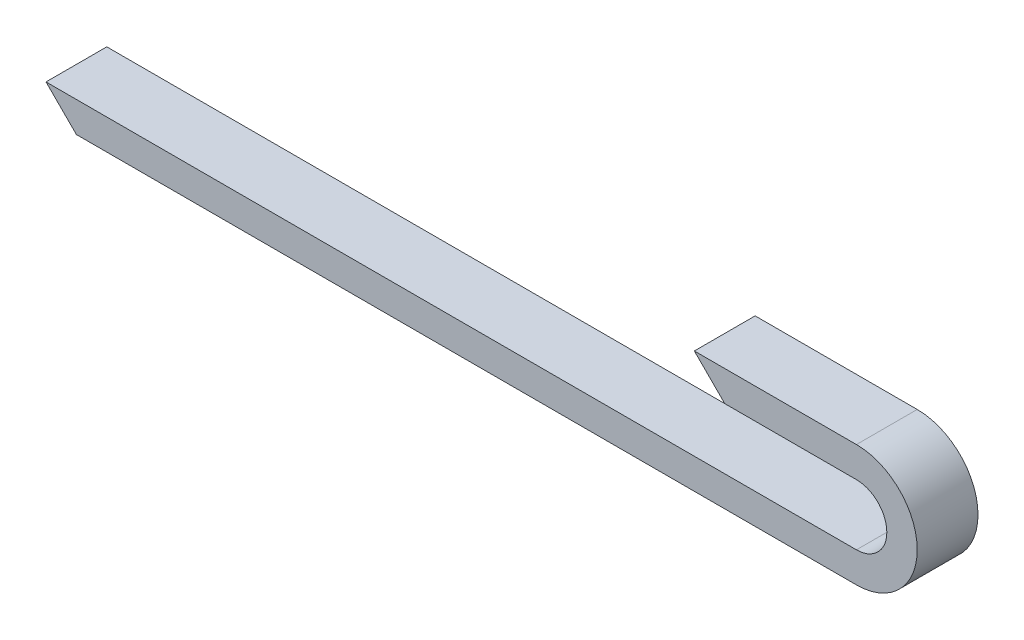
ISO-10303-21;
HEADER;
FILE_DESCRIPTION(('STEP AP214'),'2;1');
FILE_NAME('part.step','',(''),(''),'','','');
FILE_SCHEMA(('AUTOMOTIVE_DESIGN { 1 0 10303 214 1 1 1 1 }'));
ENDSEC;
DATA;
#1=APPLICATION_CONTEXT('core data for automotive mechanical design processes');
#2=APPLICATION_PROTOCOL_DEFINITION('international standard','automotive_design',2000,#1);
#3=PRODUCT_CONTEXT('',#1,'mechanical');
#4=PRODUCT('Part','Part','',(#3));
#5=PRODUCT_RELATED_PRODUCT_CATEGORY('part','',(#4));
#6=PRODUCT_DEFINITION_FORMATION('','',#4);
#7=PRODUCT_DEFINITION_CONTEXT('part definition',#1,'design');
#8=PRODUCT_DEFINITION('design','',#6,#7);
#9=PRODUCT_DEFINITION_SHAPE('','',#8);
#10=(LENGTH_UNIT() NAMED_UNIT(*) SI_UNIT(.MILLI.,.METRE.));
#11=(NAMED_UNIT(*) PLANE_ANGLE_UNIT() SI_UNIT($,.RADIAN.));
#12=(NAMED_UNIT(*) SI_UNIT($,.STERADIAN.) SOLID_ANGLE_UNIT());
#13=UNCERTAINTY_MEASURE_WITH_UNIT(LENGTH_MEASURE(1.E-05),#10,'distance_accuracy_value','');
#14=(GEOMETRIC_REPRESENTATION_CONTEXT(3) GLOBAL_UNCERTAINTY_ASSIGNED_CONTEXT((#13)) GLOBAL_UNIT_ASSIGNED_CONTEXT((#10,
#11,#12)) REPRESENTATION_CONTEXT('',''));
#15=CARTESIAN_POINT('',(0.,0.,0.));
#16=DIRECTION('',(0.,0.,1.));
#17=DIRECTION('',(1.,0.,0.));
#18=AXIS2_PLACEMENT_3D('',#15,#16,#17);
#19=CARTESIAN_POINT('',(325.210180135895,25.4258802417569,-51.));
#20=DIRECTION('',(0.,0.,1.));
#21=DIRECTION('',(1.,0.,0.));
#22=AXIS2_PLACEMENT_3D('',#19,#20,#21);
#23=CYLINDRICAL_SURFACE('',#22,51.);
#24=CARTESIAN_POINT('',(325.210180135895,25.4258802417569,0.));
#25=DIRECTION('',(0.,0.,1.));
#26=DIRECTION('',(1.,0.,0.));
#27=AXIS2_PLACEMENT_3D('',#24,#25,#26);
#28=CIRCLE('',#27,51.);
#29=CARTESIAN_POINT('',(325.210180135895,76.4258802417569,0.));
#30=VERTEX_POINT('',#29);
#31=CARTESIAN_POINT('',(325.210180135895,-25.5741197582431,0.));
#32=VERTEX_POINT('',#31);
#33=EDGE_CURVE('E137',#30,#32,#28,.F.);
#34=ORIENTED_EDGE('',*,*,#33,.T.);
#35=DIRECTION('',(0.,0.,1.));
#36=VECTOR('',#35,1.);
#37=CARTESIAN_POINT('',(325.210180135895,-25.5741197582431,-51.));
#38=LINE('',#37,#36);
#39=CARTESIAN_POINT('',(325.210180135895,-25.5741197582431,-51.));
#40=VERTEX_POINT('',#39);
#41=EDGE_CURVE('E11',#40,#32,#38,.T.);
#42=ORIENTED_EDGE('',*,*,#41,.F.);
#43=CARTESIAN_POINT('',(325.210180135895,25.4258802417569,-51.));
#44=DIRECTION('',(0.,0.,1.));
#45=DIRECTION('',(1.,0.,0.));
#46=AXIS2_PLACEMENT_3D('',#43,#44,#45);
#47=CIRCLE('',#46,51.);
#48=CARTESIAN_POINT('',(325.210180135895,76.4258802417569,-51.));
#49=VERTEX_POINT('',#48);
#50=EDGE_CURVE('E155',#49,#40,#47,.F.);
#51=ORIENTED_EDGE('',*,*,#50,.F.);
#52=DIRECTION('',(0.,0.,1.));
#53=VECTOR('',#52,1.);
#54=CARTESIAN_POINT('',(325.210180135895,76.4258802417569,-51.));
#55=LINE('',#54,#53);
#56=EDGE_CURVE('E43',#49,#30,#55,.T.);
#57=ORIENTED_EDGE('',*,*,#56,.T.);
#58=EDGE_LOOP('',(#34,#42,#51,#57));
#59=FACE_BOUND('',#58,.T.);
#60=ADVANCED_FACE('F40',(#59),#23,.T.);
#61=CARTESIAN_POINT('',(0.,-25.5741197582432,-51.));
#62=DIRECTION('',(0.,1.,0.));
#63=DIRECTION('',(-1.,0.,0.));
#64=AXIS2_PLACEMENT_3D('',#61,#62,#63);
#65=PLANE('',#64);
#66=DIRECTION('',(-1.,0.,0.));
#67=VECTOR('',#66,1.);
#68=CARTESIAN_POINT('',(0.,-25.5741197582432,0.));
#69=LINE('',#68,#67);
#70=CARTESIAN_POINT('',(-329.289819864105,-25.5741197582432,0.));
#71=VERTEX_POINT('',#70);
#72=EDGE_CURVE('E83',#32,#71,#69,.T.);
#73=ORIENTED_EDGE('',*,*,#72,.T.);
#74=DIRECTION('',(0.,0.,1.));
#75=VECTOR('',#74,1.);
#76=CARTESIAN_POINT('',(-329.289819864105,-25.5741197582432,-51.));
#77=LINE('',#76,#75);
#78=CARTESIAN_POINT('',(-329.289819864105,-25.5741197582432,-51.));
#79=VERTEX_POINT('',#78);
#80=EDGE_CURVE('E49',#79,#71,#77,.T.);
#81=ORIENTED_EDGE('',*,*,#80,.F.);
#82=DIRECTION('',(-1.,0.,0.));
#83=VECTOR('',#82,1.);
#84=CARTESIAN_POINT('',(0.,-25.5741197582432,-51.));
#85=LINE('',#84,#83);
#86=EDGE_CURVE('E57',#40,#79,#85,.T.);
#87=ORIENTED_EDGE('',*,*,#86,.F.);
#88=ORIENTED_EDGE('',*,*,#41,.T.);
#89=EDGE_LOOP('',(#73,#81,#87,#88));
#90=FACE_BOUND('',#89,.T.);
#91=ADVANCED_FACE('F180',(#90),#65,.F.);
#92=CARTESIAN_POINT('',(-177.431969811174,-177.431969811174,-51.));
#93=DIRECTION('',(0.707106781186547,0.707106781186547,0.));
#94=DIRECTION('',(-0.707106781186548,0.707106781186548,0.));
#95=AXIS2_PLACEMENT_3D('',#92,#93,#94);
#96=PLANE('',#95);
#97=DIRECTION('',(-0.707106781186548,0.707106781186548,0.));
#98=VECTOR('',#97,1.);
#99=CARTESIAN_POINT('',(-177.431969811174,-177.431969811174,0.));
#100=LINE('',#99,#98);
#101=CARTESIAN_POINT('',(-354.789819864105,-0.0741197582431838,0.));
#102=VERTEX_POINT('',#101);
#103=EDGE_CURVE('E122',#71,#102,#100,.T.);
#104=ORIENTED_EDGE('',*,*,#103,.T.);
#105=DIRECTION('',(0.,0.,1.));
#106=VECTOR('',#105,1.);
#107=CARTESIAN_POINT('',(-354.789819864105,-0.0741197582431838,-51.));
#108=LINE('',#107,#106);
#109=CARTESIAN_POINT('',(-354.789819864105,-0.0741197582431838,-51.));
#110=VERTEX_POINT('',#109);
#111=EDGE_CURVE('E120',#110,#102,#108,.T.);
#112=ORIENTED_EDGE('',*,*,#111,.F.);
#113=DIRECTION('',(-0.707106781186548,0.707106781186548,0.));
#114=VECTOR('',#113,1.);
#115=CARTESIAN_POINT('',(-177.431969811174,-177.431969811174,-51.));
#116=LINE('',#115,#114);
#117=EDGE_CURVE('E110',#79,#110,#116,.T.);
#118=ORIENTED_EDGE('',*,*,#117,.F.);
#119=ORIENTED_EDGE('',*,*,#80,.T.);
#120=EDGE_LOOP('',(#104,#112,#118,#119));
#121=FACE_BOUND('',#120,.T.);
#122=ADVANCED_FACE('F121',(#121),#96,.F.);
#123=CARTESIAN_POINT('',(0.,-0.0741197582431653,-51.));
#124=DIRECTION('',(0.,-1.,0.));
#125=DIRECTION('',(1.,0.,0.));
#126=AXIS2_PLACEMENT_3D('',#123,#124,#125);
#127=PLANE('',#126);
#128=DIRECTION('',(1.,0.,0.));
#129=VECTOR('',#128,1.);
#130=CARTESIAN_POINT('',(0.,-0.0741197582431653,0.));
#131=LINE('',#130,#129);
#132=CARTESIAN_POINT('',(325.210180135895,-0.0741197582431484,0.));
#133=VERTEX_POINT('',#132);
#134=EDGE_CURVE('E152',#102,#133,#131,.T.);
#135=ORIENTED_EDGE('',*,*,#134,.T.);
#136=DIRECTION('',(0.,0.,1.));
#137=VECTOR('',#136,1.);
#138=CARTESIAN_POINT('',(325.210180135895,-0.0741197582431484,-51.));
#139=LINE('',#138,#137);
#140=CARTESIAN_POINT('',(325.210180135895,-0.0741197582431484,-51.));
#141=VERTEX_POINT('',#140);
#142=EDGE_CURVE('E126',#141,#133,#139,.T.);
#143=ORIENTED_EDGE('',*,*,#142,.F.);
#144=DIRECTION('',(1.,0.,0.));
#145=VECTOR('',#144,1.);
#146=CARTESIAN_POINT('',(0.,-0.0741197582431653,-51.));
#147=LINE('',#146,#145);
#148=EDGE_CURVE('E115',#110,#141,#147,.T.);
#149=ORIENTED_EDGE('',*,*,#148,.F.);
#150=ORIENTED_EDGE('',*,*,#111,.T.);
#151=EDGE_LOOP('',(#135,#143,#149,#150));
#152=FACE_BOUND('',#151,.T.);
#153=ADVANCED_FACE('F128',(#152),#127,.F.);
#154=CARTESIAN_POINT('',(325.210180135895,25.4258802417569,-51.));
#155=DIRECTION('',(0.,0.,1.));
#156=DIRECTION('',(1.,0.,0.));
#157=AXIS2_PLACEMENT_3D('',#154,#155,#156);
#158=CYLINDRICAL_SURFACE('',#157,25.5);
#159=CARTESIAN_POINT('',(325.210180135895,25.4258802417569,0.));
#160=DIRECTION('',(0.,0.,1.));
#161=DIRECTION('',(1.,0.,0.));
#162=AXIS2_PLACEMENT_3D('',#159,#160,#161);
#163=CIRCLE('',#162,25.5);
#164=CARTESIAN_POINT('',(325.210180135895,50.9258802417569,0.));
#165=VERTEX_POINT('',#164);
#166=EDGE_CURVE('E149',#165,#133,#163,.F.);
#167=ORIENTED_EDGE('',*,*,#166,.F.);
#168=DIRECTION('',(0.,0.,1.));
#169=VECTOR('',#168,1.);
#170=CARTESIAN_POINT('',(325.210180135895,50.9258802417569,-51.));
#171=LINE('',#170,#169);
#172=CARTESIAN_POINT('',(325.210180135895,50.9258802417569,-51.));
#173=VERTEX_POINT('',#172);
#174=EDGE_CURVE('E159',#173,#165,#171,.T.);
#175=ORIENTED_EDGE('',*,*,#174,.F.);
#176=CARTESIAN_POINT('',(325.210180135895,25.4258802417569,-51.));
#177=DIRECTION('',(0.,0.,1.));
#178=DIRECTION('',(1.,0.,0.));
#179=AXIS2_PLACEMENT_3D('',#176,#177,#178);
#180=CIRCLE('',#179,25.5);
#181=EDGE_CURVE('E130',#173,#141,#180,.F.);
#182=ORIENTED_EDGE('',*,*,#181,.T.);
#183=ORIENTED_EDGE('',*,*,#142,.T.);
#184=EDGE_LOOP('',(#167,#175,#182,#183));
#185=FACE_BOUND('',#184,.T.);
#186=ADVANCED_FACE('F193',(#185),#158,.F.);
#187=CARTESIAN_POINT('',(0.,50.9258802417569,-51.));
#188=DIRECTION('',(0.,1.,0.));
#189=DIRECTION('',(-1.,0.,0.));
#190=AXIS2_PLACEMENT_3D('',#187,#188,#189);
#191=PLANE('',#190);
#192=DIRECTION('',(-1.,0.,0.));
#193=VECTOR('',#192,1.);
#194=CARTESIAN_POINT('',(0.,50.9258802417569,0.));
#195=LINE('',#194,#193);
#196=CARTESIAN_POINT('',(214.710180135895,50.9258802417569,0.));
#197=VERTEX_POINT('',#196);
#198=EDGE_CURVE('E146',#165,#197,#195,.T.);
#199=ORIENTED_EDGE('',*,*,#198,.T.);
#200=DIRECTION('',(0.,0.,1.));
#201=VECTOR('',#200,1.);
#202=CARTESIAN_POINT('',(214.710180135895,50.9258802417569,-51.));
#203=LINE('',#202,#201);
#204=CARTESIAN_POINT('',(214.710180135895,50.9258802417569,-51.));
#205=VERTEX_POINT('',#204);
#206=EDGE_CURVE('E161',#205,#197,#203,.T.);
#207=ORIENTED_EDGE('',*,*,#206,.F.);
#208=DIRECTION('',(-1.,0.,0.));
#209=VECTOR('',#208,1.);
#210=CARTESIAN_POINT('',(0.,50.9258802417569,-51.));
#211=LINE('',#210,#209);
#212=EDGE_CURVE('E132',#173,#205,#211,.T.);
#213=ORIENTED_EDGE('',*,*,#212,.F.);
#214=ORIENTED_EDGE('',*,*,#174,.T.);
#215=EDGE_LOOP('',(#199,#207,#213,#214));
#216=FACE_BOUND('',#215,.T.);
#217=ADVANCED_FACE('F176',(#216),#191,.F.);
#218=CARTESIAN_POINT('',(132.818030188825,132.818030188826,-51.));
#219=DIRECTION('',(-0.707106781186547,-0.707106781186549,0.));
#220=DIRECTION('',(0.707106781186549,-0.707106781186547,0.));
#221=AXIS2_PLACEMENT_3D('',#218,#219,#220);
#222=PLANE('',#221);
#223=DIRECTION('',(0.707106781186548,-0.707106781186547,0.));
#224=VECTOR('',#223,1.);
#225=CARTESIAN_POINT('',(132.818030188825,132.818030188826,0.));
#226=LINE('',#225,#224);
#227=CARTESIAN_POINT('',(189.210180135895,76.4258802417569,0.));
#228=VERTEX_POINT('',#227);
#229=EDGE_CURVE('E143',#228,#197,#226,.T.);
#230=ORIENTED_EDGE('',*,*,#229,.F.);
#231=DIRECTION('',(0.,0.,1.));
#232=VECTOR('',#231,1.);
#233=CARTESIAN_POINT('',(189.210180135895,76.4258802417569,-51.));
#234=LINE('',#233,#232);
#235=CARTESIAN_POINT('',(189.210180135895,76.4258802417569,-51.));
#236=VERTEX_POINT('',#235);
#237=EDGE_CURVE('E162',#236,#228,#234,.T.);
#238=ORIENTED_EDGE('',*,*,#237,.F.);
#239=DIRECTION('',(0.707106781186548,-0.707106781186547,0.));
#240=VECTOR('',#239,1.);
#241=CARTESIAN_POINT('',(132.818030188825,132.818030188826,-51.));
#242=LINE('',#241,#240);
#243=EDGE_CURVE('E207',#236,#205,#242,.T.);
#244=ORIENTED_EDGE('',*,*,#243,.T.);
#245=ORIENTED_EDGE('',*,*,#206,.T.);
#246=EDGE_LOOP('',(#230,#238,#244,#245));
#247=FACE_BOUND('',#246,.T.);
#248=ADVANCED_FACE('F170',(#247),#222,.T.);
#249=CARTESIAN_POINT('',(0.,76.4258802417569,-51.));
#250=DIRECTION('',(0.,1.,0.));
#251=DIRECTION('',(-1.,0.,0.));
#252=AXIS2_PLACEMENT_3D('',#249,#250,#251);
#253=PLANE('',#252);
#254=DIRECTION('',(-1.,0.,0.));
#255=VECTOR('',#254,1.);
#256=CARTESIAN_POINT('',(0.,76.4258802417569,0.));
#257=LINE('',#256,#255);
#258=EDGE_CURVE('E140',#30,#228,#257,.T.);
#259=ORIENTED_EDGE('',*,*,#258,.F.);
#260=ORIENTED_EDGE('',*,*,#56,.F.);
#261=DIRECTION('',(-1.,0.,0.));
#262=VECTOR('',#261,1.);
#263=CARTESIAN_POINT('',(0.,76.4258802417569,-51.));
#264=LINE('',#263,#262);
#265=EDGE_CURVE('E208',#49,#236,#264,.T.);
#266=ORIENTED_EDGE('',*,*,#265,.T.);
#267=ORIENTED_EDGE('',*,*,#237,.T.);
#268=EDGE_LOOP('',(#259,#260,#266,#267));
#269=FACE_BOUND('',#268,.T.);
#270=ADVANCED_FACE('F168',(#269),#253,.T.);
#271=CARTESIAN_POINT('',(0.,0.,-51.));
#272=DIRECTION('',(0.,0.,1.));
#273=DIRECTION('',(1.,0.,0.));
#274=AXIS2_PLACEMENT_3D('',#271,#272,#273);
#275=PLANE('',#274);
#276=ORIENTED_EDGE('',*,*,#50,.T.);
#277=ORIENTED_EDGE('',*,*,#86,.T.);
#278=ORIENTED_EDGE('',*,*,#117,.T.);
#279=ORIENTED_EDGE('',*,*,#148,.T.);
#280=ORIENTED_EDGE('',*,*,#181,.F.);
#281=ORIENTED_EDGE('',*,*,#212,.T.);
#282=ORIENTED_EDGE('',*,*,#243,.F.);
#283=ORIENTED_EDGE('',*,*,#265,.F.);
#284=EDGE_LOOP('',(#276,#277,#278,#279,#280,#281,#282,#283));
#285=FACE_BOUND('',#284,.T.);
#286=ADVANCED_FACE('F112',(#285),#275,.F.);
#287=CARTESIAN_POINT('',(0.,0.,0.));
#288=DIRECTION('',(0.,0.,1.));
#289=DIRECTION('',(1.,0.,0.));
#290=AXIS2_PLACEMENT_3D('',#287,#288,#289);
#291=PLANE('',#290);
#292=ORIENTED_EDGE('',*,*,#33,.F.);
#293=ORIENTED_EDGE('',*,*,#258,.T.);
#294=ORIENTED_EDGE('',*,*,#229,.T.);
#295=ORIENTED_EDGE('',*,*,#198,.F.);
#296=ORIENTED_EDGE('',*,*,#166,.T.);
#297=ORIENTED_EDGE('',*,*,#134,.F.);
#298=ORIENTED_EDGE('',*,*,#103,.F.);
#299=ORIENTED_EDGE('',*,*,#72,.F.);
#300=EDGE_LOOP('',(#292,#293,#294,#295,#296,#297,#298,#299));
#301=FACE_BOUND('',#300,.T.);
#302=ADVANCED_FACE('F167',(#301),#291,.T.);
#303=CLOSED_SHELL('',(#60,#91,#122,#153,#186,#217,#248,#270,#286,#302));
#304=MANIFOLD_SOLID_BREP('B2',#303);
#305=ADVANCED_BREP_SHAPE_REPRESENTATION('',(#18,#304),#14);
#306=SHAPE_DEFINITION_REPRESENTATION(#9,#305);
ENDSEC;
END-ISO-10303-21;
